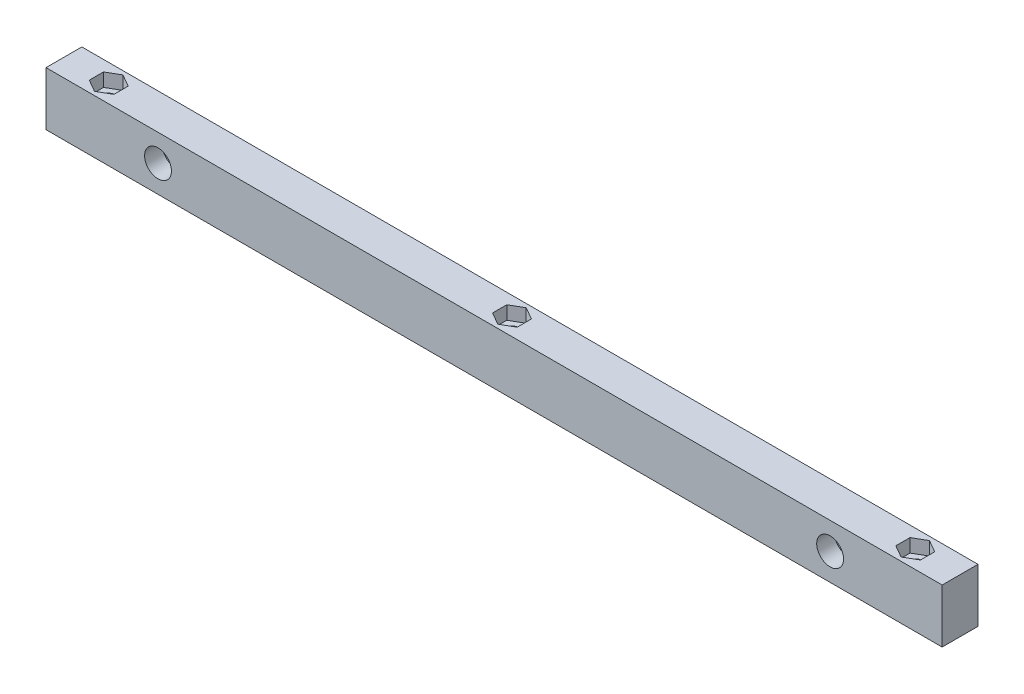
ISO-10303-21;
HEADER;
FILE_DESCRIPTION(('STEP AP214'),'2;1');
FILE_NAME('part.step','',(''),(''),'','','');
FILE_SCHEMA(('AUTOMOTIVE_DESIGN { 1 0 10303 214 1 1 1 1 }'));
ENDSEC;
DATA;
#1=APPLICATION_CONTEXT('core data for automotive mechanical design processes');
#2=APPLICATION_PROTOCOL_DEFINITION('international standard','automotive_design',2000,#1);
#3=PRODUCT_CONTEXT('',#1,'mechanical');
#4=PRODUCT('Part','Part','',(#3));
#5=PRODUCT_RELATED_PRODUCT_CATEGORY('part','',(#4));
#6=PRODUCT_DEFINITION_FORMATION('','',#4);
#7=PRODUCT_DEFINITION_CONTEXT('part definition',#1,'design');
#8=PRODUCT_DEFINITION('design','',#6,#7);
#9=PRODUCT_DEFINITION_SHAPE('','',#8);
#10=(LENGTH_UNIT() NAMED_UNIT(*) SI_UNIT(.MILLI.,.METRE.));
#11=(NAMED_UNIT(*) PLANE_ANGLE_UNIT() SI_UNIT($,.RADIAN.));
#12=(NAMED_UNIT(*) SI_UNIT($,.STERADIAN.) SOLID_ANGLE_UNIT());
#13=UNCERTAINTY_MEASURE_WITH_UNIT(LENGTH_MEASURE(1.E-05),#10,'distance_accuracy_value','');
#14=(GEOMETRIC_REPRESENTATION_CONTEXT(3) GLOBAL_UNCERTAINTY_ASSIGNED_CONTEXT((#13)) GLOBAL_UNIT_ASSIGNED_CONTEXT((#10,
#11,#12)) REPRESENTATION_CONTEXT('',''));
#15=CARTESIAN_POINT('',(0.,0.,0.));
#16=DIRECTION('',(0.,0.,1.));
#17=DIRECTION('',(1.,0.,0.));
#18=AXIS2_PLACEMENT_3D('',#15,#16,#17);
#19=CARTESIAN_POINT('',(90.,0.,-4.));
#20=DIRECTION('',(0.,1.,0.));
#21=DIRECTION('',(0.,0.,1.));
#22=AXIS2_PLACEMENT_3D('',#19,#20,#21);
#23=CYLINDRICAL_SURFACE('',#22,1.5);
#24=CARTESIAN_POINT('',(90.,0.,-4.));
#25=DIRECTION('',(0.,1.,0.));
#26=DIRECTION('',(0.,0.,1.));
#27=AXIS2_PLACEMENT_3D('',#24,#25,#26);
#28=CIRCLE('',#27,1.5);
#29=CARTESIAN_POINT('',(90.,0.,-2.5));
#30=VERTEX_POINT('',#29);
#31=EDGE_CURVE('E349',#30,#30,#28,.T.);
#32=ORIENTED_EDGE('',*,*,#31,.F.);
#33=EDGE_LOOP('',(#32));
#34=FACE_BOUND('',#33,.T.);
#35=CARTESIAN_POINT('',(90.,9.00000000000001,-4.));
#36=DIRECTION('',(0.,1.,0.));
#37=DIRECTION('',(0.,0.,1.));
#38=AXIS2_PLACEMENT_3D('',#35,#36,#37);
#39=CIRCLE('',#38,1.5);
#40=CARTESIAN_POINT('',(90.,9.00000000000001,-2.5));
#41=VERTEX_POINT('',#40);
#42=EDGE_CURVE('E36',#41,#41,#39,.F.);
#43=ORIENTED_EDGE('',*,*,#42,.F.);
#44=EDGE_LOOP('',(#43));
#45=FACE_BOUND('',#44,.T.);
#46=ADVANCED_FACE('F32',(#34,#45),#23,.F.);
#47=CARTESIAN_POINT('',(0.,0.,-4.));
#48=DIRECTION('',(0.,1.,0.));
#49=DIRECTION('',(0.,0.,1.));
#50=AXIS2_PLACEMENT_3D('',#47,#48,#49);
#51=CYLINDRICAL_SURFACE('',#50,1.5);
#52=CARTESIAN_POINT('',(0.,0.,-4.));
#53=DIRECTION('',(0.,1.,0.));
#54=DIRECTION('',(0.,0.,1.));
#55=AXIS2_PLACEMENT_3D('',#52,#53,#54);
#56=CIRCLE('',#55,1.5);
#57=CARTESIAN_POINT('',(0.,0.,-2.5));
#58=VERTEX_POINT('',#57);
#59=EDGE_CURVE('E358',#58,#58,#56,.T.);
#60=ORIENTED_EDGE('',*,*,#59,.F.);
#61=EDGE_LOOP('',(#60));
#62=FACE_BOUND('',#61,.T.);
#63=CARTESIAN_POINT('',(0.,9.00000000000001,-4.));
#64=DIRECTION('',(0.,1.,0.));
#65=DIRECTION('',(0.,0.,1.));
#66=AXIS2_PLACEMENT_3D('',#63,#64,#65);
#67=CIRCLE('',#66,1.5);
#68=CARTESIAN_POINT('',(0.,9.00000000000001,-2.5));
#69=VERTEX_POINT('',#68);
#70=EDGE_CURVE('E393',#69,#69,#67,.F.);
#71=ORIENTED_EDGE('',*,*,#70,.F.);
#72=EDGE_LOOP('',(#71));
#73=FACE_BOUND('',#72,.T.);
#74=ADVANCED_FACE('F403',(#62,#73),#51,.F.);
#75=CARTESIAN_POINT('',(-90.,0.,-4.));
#76=DIRECTION('',(0.,1.,0.));
#77=DIRECTION('',(0.,0.,1.));
#78=AXIS2_PLACEMENT_3D('',#75,#76,#77);
#79=CYLINDRICAL_SURFACE('',#78,1.5);
#80=CARTESIAN_POINT('',(-90.,0.,-4.));
#81=DIRECTION('',(0.,1.,0.));
#82=DIRECTION('',(0.,0.,1.));
#83=AXIS2_PLACEMENT_3D('',#80,#81,#82);
#84=CIRCLE('',#83,1.5);
#85=CARTESIAN_POINT('',(-90.,0.,-2.5));
#86=VERTEX_POINT('',#85);
#87=EDGE_CURVE('E354',#86,#86,#84,.T.);
#88=ORIENTED_EDGE('',*,*,#87,.F.);
#89=EDGE_LOOP('',(#88));
#90=FACE_BOUND('',#89,.T.);
#91=CARTESIAN_POINT('',(-90.,9.00000000000001,-4.));
#92=DIRECTION('',(0.,1.,0.));
#93=DIRECTION('',(0.,0.,1.));
#94=AXIS2_PLACEMENT_3D('',#91,#92,#93);
#95=CIRCLE('',#94,1.5);
#96=CARTESIAN_POINT('',(-90.,9.00000000000001,-2.5));
#97=VERTEX_POINT('',#96);
#98=EDGE_CURVE('E232',#97,#97,#95,.F.);
#99=ORIENTED_EDGE('',*,*,#98,.F.);
#100=EDGE_LOOP('',(#99));
#101=FACE_BOUND('',#100,.T.);
#102=ADVANCED_FACE('F409',(#90,#101),#79,.F.);
#103=CARTESIAN_POINT('',(75.,6.,-8.));
#104=DIRECTION('',(0.,0.,1.));
#105=DIRECTION('',(1.,0.,0.));
#106=AXIS2_PLACEMENT_3D('',#103,#104,#105);
#107=CYLINDRICAL_SURFACE('',#106,1.5);
#108=CARTESIAN_POINT('',(75.,6.,-8.));
#109=DIRECTION('',(0.,0.,1.));
#110=DIRECTION('',(-1.,0.,0.));
#111=AXIS2_PLACEMENT_3D('',#108,#109,#110);
#112=CIRCLE('',#111,1.5);
#113=CARTESIAN_POINT('',(73.5,6.,-8.));
#114=VERTEX_POINT('',#113);
#115=EDGE_CURVE('E350',#114,#114,#112,.T.);
#116=ORIENTED_EDGE('',*,*,#115,.F.);
#117=EDGE_LOOP('',(#116));
#118=FACE_BOUND('',#117,.T.);
#119=CARTESIAN_POINT('',(75.,6.,-4.));
#120=DIRECTION('',(0.,0.,1.));
#121=DIRECTION('',(1.,0.,0.));
#122=AXIS2_PLACEMENT_3D('',#119,#120,#121);
#123=CIRCLE('',#122,1.5);
#124=CARTESIAN_POINT('',(76.5,6.,-4.));
#125=VERTEX_POINT('',#124);
#126=EDGE_CURVE('E353',#125,#125,#123,.F.);
#127=ORIENTED_EDGE('',*,*,#126,.F.);
#128=EDGE_LOOP('',(#127));
#129=FACE_BOUND('',#128,.T.);
#130=ADVANCED_FACE('F475',(#118,#129),#107,.F.);
#131=CARTESIAN_POINT('',(-75.,6.,-8.));
#132=DIRECTION('',(0.,0.,1.));
#133=DIRECTION('',(1.,0.,0.));
#134=AXIS2_PLACEMENT_3D('',#131,#132,#133);
#135=CYLINDRICAL_SURFACE('',#134,1.5);
#136=CARTESIAN_POINT('',(-75.,6.,-8.));
#137=DIRECTION('',(0.,0.,1.));
#138=DIRECTION('',(1.,0.,0.));
#139=AXIS2_PLACEMENT_3D('',#136,#137,#138);
#140=CIRCLE('',#139,1.5);
#141=CARTESIAN_POINT('',(-73.5,6.,-8.));
#142=VERTEX_POINT('',#141);
#143=EDGE_CURVE('E346',#142,#142,#140,.T.);
#144=ORIENTED_EDGE('',*,*,#143,.F.);
#145=EDGE_LOOP('',(#144));
#146=FACE_BOUND('',#145,.T.);
#147=CARTESIAN_POINT('',(-75.,6.,-4.));
#148=DIRECTION('',(0.,0.,1.));
#149=DIRECTION('',(1.,0.,0.));
#150=AXIS2_PLACEMENT_3D('',#147,#148,#149);
#151=CIRCLE('',#150,1.5);
#152=CARTESIAN_POINT('',(-73.5,6.,-4.));
#153=VERTEX_POINT('',#152);
#154=EDGE_CURVE('E336',#153,#153,#151,.F.);
#155=ORIENTED_EDGE('',*,*,#154,.F.);
#156=EDGE_LOOP('',(#155));
#157=FACE_BOUND('',#156,.T.);
#158=ADVANCED_FACE('F437',(#146,#157),#135,.F.);
#159=CARTESIAN_POINT('',(-100.,12.,-8.));
#160=DIRECTION('',(1.,0.,0.));
#161=DIRECTION('',(0.,0.,-1.));
#162=AXIS2_PLACEMENT_3D('',#159,#160,#161);
#163=PLANE('',#162);
#164=DIRECTION('',(0.,0.,1.));
#165=VECTOR('',#164,1.);
#166=CARTESIAN_POINT('',(-100.,0.,-8.));
#167=LINE('',#166,#165);
#168=CARTESIAN_POINT('',(-100.,0.,-8.));
#169=VERTEX_POINT('',#168);
#170=CARTESIAN_POINT('',(-100.,0.,0.));
#171=VERTEX_POINT('',#170);
#172=EDGE_CURVE('E357',#169,#171,#167,.T.);
#173=ORIENTED_EDGE('',*,*,#172,.T.);
#174=DIRECTION('',(0.,-1.,0.));
#175=VECTOR('',#174,1.);
#176=CARTESIAN_POINT('',(-100.,12.,0.));
#177=LINE('',#176,#175);
#178=CARTESIAN_POINT('',(-100.,12.,0.));
#179=VERTEX_POINT('',#178);
#180=EDGE_CURVE('E11',#179,#171,#177,.T.);
#181=ORIENTED_EDGE('',*,*,#180,.F.);
#182=DIRECTION('',(0.,0.,1.));
#183=VECTOR('',#182,1.);
#184=CARTESIAN_POINT('',(-100.,12.,-8.));
#185=LINE('',#184,#183);
#186=CARTESIAN_POINT('',(-100.,12.,-8.));
#187=VERTEX_POINT('',#186);
#188=EDGE_CURVE('E363',#187,#179,#185,.T.);
#189=ORIENTED_EDGE('',*,*,#188,.F.);
#190=DIRECTION('',(0.,-1.,0.));
#191=VECTOR('',#190,1.);
#192=CARTESIAN_POINT('',(-100.,12.,-8.));
#193=LINE('',#192,#191);
#194=EDGE_CURVE('E373',#187,#169,#193,.T.);
#195=ORIENTED_EDGE('',*,*,#194,.T.);
#196=EDGE_LOOP('',(#173,#181,#189,#195));
#197=FACE_BOUND('',#196,.T.);
#198=ADVANCED_FACE('F34',(#197),#163,.F.);
#199=CARTESIAN_POINT('',(-100.,12.,0.));
#200=DIRECTION('',(0.,0.,-1.));
#201=DIRECTION('',(-1.,0.,0.));
#202=AXIS2_PLACEMENT_3D('',#199,#200,#201);
#203=PLANE('',#202);
#204=CARTESIAN_POINT('',(-75.,6.,0.));
#205=DIRECTION('',(0.,0.,1.));
#206=DIRECTION('',(1.,0.,0.));
#207=AXIS2_PLACEMENT_3D('',#204,#205,#206);
#208=CIRCLE('',#207,3.00000000000001);
#209=CARTESIAN_POINT('',(-72.,6.,0.));
#210=VERTEX_POINT('',#209);
#211=EDGE_CURVE('E337',#210,#210,#208,.T.);
#212=ORIENTED_EDGE('',*,*,#211,.F.);
#213=EDGE_LOOP('',(#212));
#214=FACE_BOUND('',#213,.T.);
#215=CARTESIAN_POINT('',(75.,6.,0.));
#216=DIRECTION('',(0.,0.,1.));
#217=DIRECTION('',(1.,0.,0.));
#218=AXIS2_PLACEMENT_3D('',#215,#216,#217);
#219=CIRCLE('',#218,3.00000000000001);
#220=CARTESIAN_POINT('',(78.,6.,0.));
#221=VERTEX_POINT('',#220);
#222=EDGE_CURVE('E343',#221,#221,#219,.T.);
#223=ORIENTED_EDGE('',*,*,#222,.F.);
#224=EDGE_LOOP('',(#223));
#225=FACE_BOUND('',#224,.T.);
#226=DIRECTION('',(1.,0.,0.));
#227=VECTOR('',#226,1.);
#228=CARTESIAN_POINT('',(-100.,0.,0.));
#229=LINE('',#228,#227);
#230=CARTESIAN_POINT('',(100.,0.,0.));
#231=VERTEX_POINT('',#230);
#232=EDGE_CURVE('E376',#171,#231,#229,.T.);
#233=ORIENTED_EDGE('',*,*,#232,.T.);
#234=DIRECTION('',(0.,-1.,0.));
#235=VECTOR('',#234,1.);
#236=CARTESIAN_POINT('',(100.,12.,0.));
#237=LINE('',#236,#235);
#238=CARTESIAN_POINT('',(100.,12.,0.));
#239=VERTEX_POINT('',#238);
#240=EDGE_CURVE('E41',#239,#231,#237,.T.);
#241=ORIENTED_EDGE('',*,*,#240,.F.);
#242=DIRECTION('',(1.,0.,0.));
#243=VECTOR('',#242,1.);
#244=CARTESIAN_POINT('',(-100.,12.,0.));
#245=LINE('',#244,#243);
#246=EDGE_CURVE('E366',#179,#239,#245,.T.);
#247=ORIENTED_EDGE('',*,*,#246,.F.);
#248=ORIENTED_EDGE('',*,*,#180,.T.);
#249=EDGE_LOOP('',(#233,#241,#247,#248));
#250=FACE_BOUND('',#249,.T.);
#251=ADVANCED_FACE('F430',(#214,#225,#250),#203,.F.);
#252=CARTESIAN_POINT('',(100.,12.,-8.));
#253=DIRECTION('',(-1.,0.,0.));
#254=DIRECTION('',(0.,0.,1.));
#255=AXIS2_PLACEMENT_3D('',#252,#253,#254);
#256=PLANE('',#255);
#257=DIRECTION('',(0.,0.,-1.));
#258=VECTOR('',#257,1.);
#259=CARTESIAN_POINT('',(100.,0.,-8.));
#260=LINE('',#259,#258);
#261=CARTESIAN_POINT('',(100.,0.,-8.));
#262=VERTEX_POINT('',#261);
#263=EDGE_CURVE('E378',#231,#262,#260,.T.);
#264=ORIENTED_EDGE('',*,*,#263,.T.);
#265=DIRECTION('',(0.,-1.,0.));
#266=VECTOR('',#265,1.);
#267=CARTESIAN_POINT('',(100.,12.,-8.));
#268=LINE('',#267,#266);
#269=CARTESIAN_POINT('',(100.,12.,-8.));
#270=VERTEX_POINT('',#269);
#271=EDGE_CURVE('E383',#270,#262,#268,.T.);
#272=ORIENTED_EDGE('',*,*,#271,.F.);
#273=DIRECTION('',(0.,0.,-1.));
#274=VECTOR('',#273,1.);
#275=CARTESIAN_POINT('',(100.,12.,-8.));
#276=LINE('',#275,#274);
#277=EDGE_CURVE('E369',#239,#270,#276,.T.);
#278=ORIENTED_EDGE('',*,*,#277,.F.);
#279=ORIENTED_EDGE('',*,*,#240,.T.);
#280=EDGE_LOOP('',(#264,#272,#278,#279));
#281=FACE_BOUND('',#280,.T.);
#282=ADVANCED_FACE('F427',(#281),#256,.F.);
#283=CARTESIAN_POINT('',(-100.,12.,-8.));
#284=DIRECTION('',(0.,0.,1.));
#285=DIRECTION('',(1.,0.,0.));
#286=AXIS2_PLACEMENT_3D('',#283,#284,#285);
#287=PLANE('',#286);
#288=ORIENTED_EDGE('',*,*,#143,.T.);
#289=EDGE_LOOP('',(#288));
#290=FACE_BOUND('',#289,.T.);
#291=ORIENTED_EDGE('',*,*,#115,.T.);
#292=EDGE_LOOP('',(#291));
#293=FACE_BOUND('',#292,.T.);
#294=DIRECTION('',(-1.,0.,0.));
#295=VECTOR('',#294,1.);
#296=CARTESIAN_POINT('',(-100.,0.,-8.));
#297=LINE('',#296,#295);
#298=EDGE_CURVE('E367',#262,#169,#297,.T.);
#299=ORIENTED_EDGE('',*,*,#298,.T.);
#300=ORIENTED_EDGE('',*,*,#194,.F.);
#301=DIRECTION('',(-1.,0.,0.));
#302=VECTOR('',#301,1.);
#303=CARTESIAN_POINT('',(-100.,12.,-8.));
#304=LINE('',#303,#302);
#305=EDGE_CURVE('E371',#270,#187,#304,.T.);
#306=ORIENTED_EDGE('',*,*,#305,.F.);
#307=ORIENTED_EDGE('',*,*,#271,.T.);
#308=EDGE_LOOP('',(#299,#300,#306,#307));
#309=FACE_BOUND('',#308,.T.);
#310=ADVANCED_FACE('F419',(#290,#293,#309),#287,.F.);
#311=CARTESIAN_POINT('',(0.,12.,0.));
#312=DIRECTION('',(0.,1.,0.));
#313=DIRECTION('',(0.,0.,1.));
#314=AXIS2_PLACEMENT_3D('',#311,#312,#313);
#315=PLANE('',#314);
#316=DIRECTION('',(0.,0.,-1.));
#317=VECTOR('',#316,1.);
#318=CARTESIAN_POINT('',(-87.25,12.,-2.41228675972853));
#319=LINE('',#318,#317);
#320=CARTESIAN_POINT('',(-87.25,12.,-2.41228675972853));
#321=VERTEX_POINT('',#320);
#322=CARTESIAN_POINT('',(-87.25,12.,-5.58771324027146));
#323=VERTEX_POINT('',#322);
#324=EDGE_CURVE('E49',#321,#323,#319,.T.);
#325=ORIENTED_EDGE('',*,*,#324,.F.);
#326=DIRECTION('',(0.866025403784438,0.,-0.500000000000001));
#327=VECTOR('',#326,1.);
#328=CARTESIAN_POINT('',(-90.,12.,-0.824573519457051));
#329=LINE('',#328,#327);
#330=CARTESIAN_POINT('',(-90.,12.,-0.824573519457051));
#331=VERTEX_POINT('',#330);
#332=EDGE_CURVE('E205',#331,#321,#329,.T.);
#333=ORIENTED_EDGE('',*,*,#332,.F.);
#334=DIRECTION('',(0.866025403784439,0.,0.5));
#335=VECTOR('',#334,1.);
#336=CARTESIAN_POINT('',(-92.75,12.,-2.41228675972852));
#337=LINE('',#336,#335);
#338=CARTESIAN_POINT('',(-92.75,12.,-2.41228675972852));
#339=VERTEX_POINT('',#338);
#340=EDGE_CURVE('E208',#339,#331,#337,.T.);
#341=ORIENTED_EDGE('',*,*,#340,.F.);
#342=DIRECTION('',(0.,0.,1.));
#343=VECTOR('',#342,1.);
#344=CARTESIAN_POINT('',(-92.75,12.,-5.58771324027147));
#345=LINE('',#344,#343);
#346=CARTESIAN_POINT('',(-92.75,12.,-5.58771324027147));
#347=VERTEX_POINT('',#346);
#348=EDGE_CURVE('E225',#347,#339,#345,.T.);
#349=ORIENTED_EDGE('',*,*,#348,.F.);
#350=DIRECTION('',(-0.866025403784439,0.,0.5));
#351=VECTOR('',#350,1.);
#352=CARTESIAN_POINT('',(-90.,12.,-7.17542648054294));
#353=LINE('',#352,#351);
#354=CARTESIAN_POINT('',(-90.,12.,-7.17542648054294));
#355=VERTEX_POINT('',#354);
#356=EDGE_CURVE('E222',#355,#347,#353,.T.);
#357=ORIENTED_EDGE('',*,*,#356,.F.);
#358=DIRECTION('',(-0.866025403784438,0.,-0.5));
#359=VECTOR('',#358,1.);
#360=CARTESIAN_POINT('',(-87.25,12.,-5.58771324027147));
#361=LINE('',#360,#359);
#362=EDGE_CURVE('E219',#323,#355,#361,.T.);
#363=ORIENTED_EDGE('',*,*,#362,.F.);
#364=EDGE_LOOP('',(#325,#333,#341,#349,#357,#363));
#365=FACE_BOUND('',#364,.T.);
#366=DIRECTION('',(0.,0.,-1.));
#367=VECTOR('',#366,1.);
#368=CARTESIAN_POINT('',(2.75,12.,-2.41228675972853));
#369=LINE('',#368,#367);
#370=CARTESIAN_POINT('',(2.75,12.,-2.41228675972853));
#371=VERTEX_POINT('',#370);
#372=CARTESIAN_POINT('',(2.75,12.,-5.58771324027147));
#373=VERTEX_POINT('',#372);
#374=EDGE_CURVE('E57',#371,#373,#369,.T.);
#375=ORIENTED_EDGE('',*,*,#374,.F.);
#376=DIRECTION('',(0.866025403784439,0.,-0.499999999999999));
#377=VECTOR('',#376,1.);
#378=CARTESIAN_POINT('',(0.,12.,-0.824573519457062));
#379=LINE('',#378,#377);
#380=CARTESIAN_POINT('',(0.,12.,-0.824573519457062));
#381=VERTEX_POINT('',#380);
#382=EDGE_CURVE('E244',#381,#371,#379,.T.);
#383=ORIENTED_EDGE('',*,*,#382,.F.);
#384=DIRECTION('',(0.866025403784439,0.,0.5));
#385=VECTOR('',#384,1.);
#386=CARTESIAN_POINT('',(-2.75,12.,-2.41228675972853));
#387=LINE('',#386,#385);
#388=CARTESIAN_POINT('',(-2.75,12.,-2.41228675972853));
#389=VERTEX_POINT('',#388);
#390=EDGE_CURVE('E271',#389,#381,#387,.T.);
#391=ORIENTED_EDGE('',*,*,#390,.F.);
#392=DIRECTION('',(0.,0.,1.));
#393=VECTOR('',#392,1.);
#394=CARTESIAN_POINT('',(-2.75,12.,-5.58771324027147));
#395=LINE('',#394,#393);
#396=CARTESIAN_POINT('',(-2.75,12.,-5.58771324027147));
#397=VERTEX_POINT('',#396);
#398=EDGE_CURVE('E268',#397,#389,#395,.T.);
#399=ORIENTED_EDGE('',*,*,#398,.F.);
#400=DIRECTION('',(-0.866025403784439,0.,0.5));
#401=VECTOR('',#400,1.);
#402=CARTESIAN_POINT('',(0.,12.,-7.17542648054294));
#403=LINE('',#402,#401);
#404=CARTESIAN_POINT('',(0.,12.,-7.17542648054294));
#405=VERTEX_POINT('',#404);
#406=EDGE_CURVE('E265',#405,#397,#403,.T.);
#407=ORIENTED_EDGE('',*,*,#406,.F.);
#408=DIRECTION('',(-0.866025403784439,0.,-0.5));
#409=VECTOR('',#408,1.);
#410=CARTESIAN_POINT('',(2.75,12.,-5.58771324027147));
#411=LINE('',#410,#409);
#412=EDGE_CURVE('E261',#373,#405,#411,.T.);
#413=ORIENTED_EDGE('',*,*,#412,.F.);
#414=EDGE_LOOP('',(#375,#383,#391,#399,#407,#413));
#415=FACE_BOUND('',#414,.T.);
#416=DIRECTION('',(0.,0.,-1.));
#417=VECTOR('',#416,1.);
#418=CARTESIAN_POINT('',(92.75,12.,-2.41228675972853));
#419=LINE('',#418,#417);
#420=CARTESIAN_POINT('',(92.75,12.,-2.41228675972853));
#421=VERTEX_POINT('',#420);
#422=CARTESIAN_POINT('',(92.75,12.,-5.58771324027146));
#423=VERTEX_POINT('',#422);
#424=EDGE_CURVE('E306',#421,#423,#419,.T.);
#425=ORIENTED_EDGE('',*,*,#424,.F.);
#426=DIRECTION('',(0.866025403784437,0.,-0.500000000000002));
#427=VECTOR('',#426,1.);
#428=CARTESIAN_POINT('',(90.,12.,-0.824573519457066));
#429=LINE('',#428,#427);
#430=CARTESIAN_POINT('',(90.,12.,-0.824573519457066));
#431=VERTEX_POINT('',#430);
#432=EDGE_CURVE('E290',#431,#421,#429,.T.);
#433=ORIENTED_EDGE('',*,*,#432,.F.);
#434=DIRECTION('',(0.866025403784439,0.,0.5));
#435=VECTOR('',#434,1.);
#436=CARTESIAN_POINT('',(87.25,12.,-2.41228675972854));
#437=LINE('',#436,#435);
#438=CARTESIAN_POINT('',(87.25,12.,-2.41228675972854));
#439=VERTEX_POINT('',#438);
#440=EDGE_CURVE('E317',#439,#431,#437,.T.);
#441=ORIENTED_EDGE('',*,*,#440,.F.);
#442=DIRECTION('',(0.,0.,1.));
#443=VECTOR('',#442,1.);
#444=CARTESIAN_POINT('',(87.25,12.,-5.58771324027145));
#445=LINE('',#444,#443);
#446=CARTESIAN_POINT('',(87.25,12.,-5.58771324027145));
#447=VERTEX_POINT('',#446);
#448=EDGE_CURVE('E314',#447,#439,#445,.T.);
#449=ORIENTED_EDGE('',*,*,#448,.F.);
#450=DIRECTION('',(-0.866025403784439,0.,0.5));
#451=VECTOR('',#450,1.);
#452=CARTESIAN_POINT('',(90.,12.,-7.17542648054293));
#453=LINE('',#452,#451);
#454=CARTESIAN_POINT('',(90.,12.,-7.17542648054293));
#455=VERTEX_POINT('',#454);
#456=EDGE_CURVE('E311',#455,#447,#453,.T.);
#457=ORIENTED_EDGE('',*,*,#456,.F.);
#458=DIRECTION('',(-0.866025403784438,0.,-0.5));
#459=VECTOR('',#458,1.);
#460=CARTESIAN_POINT('',(92.75,12.,-5.58771324027147));
#461=LINE('',#460,#459);
#462=EDGE_CURVE('E308',#423,#455,#461,.T.);
#463=ORIENTED_EDGE('',*,*,#462,.F.);
#464=EDGE_LOOP('',(#425,#433,#441,#449,#457,#463));
#465=FACE_BOUND('',#464,.T.);
#466=ORIENTED_EDGE('',*,*,#188,.T.);
#467=ORIENTED_EDGE('',*,*,#246,.T.);
#468=ORIENTED_EDGE('',*,*,#277,.T.);
#469=ORIENTED_EDGE('',*,*,#305,.T.);
#470=EDGE_LOOP('',(#466,#467,#468,#469));
#471=FACE_BOUND('',#470,.T.);
#472=ADVANCED_FACE('F415',(#365,#415,#465,#471),#315,.T.);
#473=CARTESIAN_POINT('',(0.,0.,0.));
#474=DIRECTION('',(0.,1.,0.));
#475=DIRECTION('',(0.,0.,1.));
#476=AXIS2_PLACEMENT_3D('',#473,#474,#475);
#477=PLANE('',#476);
#478=ORIENTED_EDGE('',*,*,#87,.T.);
#479=EDGE_LOOP('',(#478));
#480=FACE_BOUND('',#479,.T.);
#481=ORIENTED_EDGE('',*,*,#59,.T.);
#482=EDGE_LOOP('',(#481));
#483=FACE_BOUND('',#482,.T.);
#484=ORIENTED_EDGE('',*,*,#31,.T.);
#485=EDGE_LOOP('',(#484));
#486=FACE_BOUND('',#485,.T.);
#487=ORIENTED_EDGE('',*,*,#172,.F.);
#488=ORIENTED_EDGE('',*,*,#298,.F.);
#489=ORIENTED_EDGE('',*,*,#263,.F.);
#490=ORIENTED_EDGE('',*,*,#232,.F.);
#491=EDGE_LOOP('',(#487,#488,#489,#490));
#492=FACE_BOUND('',#491,.T.);
#493=ADVANCED_FACE('F418',(#480,#483,#486,#492),#477,.F.);
#494=CARTESIAN_POINT('',(-75.,6.,-4.));
#495=DIRECTION('',(0.,0.,1.));
#496=DIRECTION('',(1.,0.,0.));
#497=AXIS2_PLACEMENT_3D('',#494,#495,#496);
#498=PLANE('',#497);
#499=CARTESIAN_POINT('',(-75.,6.,-4.));
#500=DIRECTION('',(0.,0.,1.));
#501=DIRECTION('',(1.,0.,0.));
#502=AXIS2_PLACEMENT_3D('',#499,#500,#501);
#503=CIRCLE('',#502,3.00000000000001);
#504=CARTESIAN_POINT('',(-72.,6.,-4.));
#505=VERTEX_POINT('',#504);
#506=EDGE_CURVE('E333',#505,#505,#503,.T.);
#507=ORIENTED_EDGE('',*,*,#506,.T.);
#508=EDGE_LOOP('',(#507));
#509=FACE_BOUND('',#508,.T.);
#510=ORIENTED_EDGE('',*,*,#154,.T.);
#511=EDGE_LOOP('',(#510));
#512=FACE_BOUND('',#511,.T.);
#513=ADVANCED_FACE('F423',(#509,#512),#498,.T.);
#514=CARTESIAN_POINT('',(-75.,6.,-4.));
#515=DIRECTION('',(0.,0.,1.));
#516=DIRECTION('',(1.,0.,0.));
#517=AXIS2_PLACEMENT_3D('',#514,#515,#516);
#518=CYLINDRICAL_SURFACE('',#517,3.00000000000001);
#519=ORIENTED_EDGE('',*,*,#506,.F.);
#520=EDGE_LOOP('',(#519));
#521=FACE_BOUND('',#520,.T.);
#522=ORIENTED_EDGE('',*,*,#211,.T.);
#523=EDGE_LOOP('',(#522));
#524=FACE_BOUND('',#523,.T.);
#525=ADVANCED_FACE('F467',(#521,#524),#518,.F.);
#526=CARTESIAN_POINT('',(75.,6.,-4.));
#527=DIRECTION('',(0.,0.,1.));
#528=DIRECTION('',(1.,0.,0.));
#529=AXIS2_PLACEMENT_3D('',#526,#527,#528);
#530=PLANE('',#529);
#531=CARTESIAN_POINT('',(75.,6.,-4.));
#532=DIRECTION('',(0.,0.,1.));
#533=DIRECTION('',(1.,0.,0.));
#534=AXIS2_PLACEMENT_3D('',#531,#532,#533);
#535=CIRCLE('',#534,3.00000000000001);
#536=CARTESIAN_POINT('',(78.,6.,-4.));
#537=VERTEX_POINT('',#536);
#538=EDGE_CURVE('E340',#537,#537,#535,.T.);
#539=ORIENTED_EDGE('',*,*,#538,.T.);
#540=EDGE_LOOP('',(#539));
#541=FACE_BOUND('',#540,.T.);
#542=ORIENTED_EDGE('',*,*,#126,.T.);
#543=EDGE_LOOP('',(#542));
#544=FACE_BOUND('',#543,.T.);
#545=ADVANCED_FACE('F459',(#541,#544),#530,.T.);
#546=CARTESIAN_POINT('',(75.,6.,-4.));
#547=DIRECTION('',(0.,0.,1.));
#548=DIRECTION('',(1.,0.,0.));
#549=AXIS2_PLACEMENT_3D('',#546,#547,#548);
#550=CYLINDRICAL_SURFACE('',#549,3.00000000000001);
#551=ORIENTED_EDGE('',*,*,#538,.F.);
#552=EDGE_LOOP('',(#551));
#553=FACE_BOUND('',#552,.T.);
#554=ORIENTED_EDGE('',*,*,#222,.T.);
#555=EDGE_LOOP('',(#554));
#556=FACE_BOUND('',#555,.T.);
#557=ADVANCED_FACE('F457',(#553,#556),#550,.F.);
#558=CARTESIAN_POINT('',(0.,9.00000000000001,0.));
#559=DIRECTION('',(0.,1.,0.));
#560=DIRECTION('',(0.,0.,1.));
#561=AXIS2_PLACEMENT_3D('',#558,#559,#560);
#562=PLANE('',#561);
#563=DIRECTION('',(0.,0.,-1.));
#564=VECTOR('',#563,1.);
#565=CARTESIAN_POINT('',(-87.25,9.00000000000001,-2.41228675972853));
#566=LINE('',#565,#564);
#567=CARTESIAN_POINT('',(-87.25,9.00000000000001,-2.41228675972853));
#568=VERTEX_POINT('',#567);
#569=CARTESIAN_POINT('',(-87.25,9.00000000000001,-5.58771324027147));
#570=VERTEX_POINT('',#569);
#571=EDGE_CURVE('E185',#568,#570,#566,.T.);
#572=ORIENTED_EDGE('',*,*,#571,.T.);
#573=DIRECTION('',(-0.866025403784438,0.,-0.5));
#574=VECTOR('',#573,1.);
#575=CARTESIAN_POINT('',(-87.25,9.00000000000001,-5.58771324027147));
#576=LINE('',#575,#574);
#577=CARTESIAN_POINT('',(-90.,9.00000000000001,-7.17542648054294));
#578=VERTEX_POINT('',#577);
#579=EDGE_CURVE('E194',#570,#578,#576,.T.);
#580=ORIENTED_EDGE('',*,*,#579,.T.);
#581=DIRECTION('',(-0.866025403784439,0.,0.5));
#582=VECTOR('',#581,1.);
#583=CARTESIAN_POINT('',(-90.,9.00000000000001,-7.17542648054294));
#584=LINE('',#583,#582);
#585=CARTESIAN_POINT('',(-92.75,9.00000000000001,-5.58771324027147));
#586=VERTEX_POINT('',#585);
#587=EDGE_CURVE('E199',#578,#586,#584,.T.);
#588=ORIENTED_EDGE('',*,*,#587,.T.);
#589=DIRECTION('',(0.,0.,1.));
#590=VECTOR('',#589,1.);
#591=CARTESIAN_POINT('',(-92.75,9.00000000000001,-5.58771324027147));
#592=LINE('',#591,#590);
#593=CARTESIAN_POINT('',(-92.75,9.00000000000001,-2.41228675972852));
#594=VERTEX_POINT('',#593);
#595=EDGE_CURVE('E212',#586,#594,#592,.T.);
#596=ORIENTED_EDGE('',*,*,#595,.T.);
#597=DIRECTION('',(0.866025403784439,0.,0.5));
#598=VECTOR('',#597,1.);
#599=CARTESIAN_POINT('',(-92.75,9.00000000000001,-2.41228675972852));
#600=LINE('',#599,#598);
#601=CARTESIAN_POINT('',(-90.,9.00000000000001,-0.824573519457051));
#602=VERTEX_POINT('',#601);
#603=EDGE_CURVE('E215',#594,#602,#600,.T.);
#604=ORIENTED_EDGE('',*,*,#603,.T.);
#605=DIRECTION('',(0.866025403784438,0.,-0.500000000000001));
#606=VECTOR('',#605,1.);
#607=CARTESIAN_POINT('',(-90.,9.00000000000001,-0.824573519457051));
#608=LINE('',#607,#606);
#609=EDGE_CURVE('E191',#602,#568,#608,.T.);
#610=ORIENTED_EDGE('',*,*,#609,.T.);
#611=EDGE_LOOP('',(#572,#580,#588,#596,#604,#610));
#612=FACE_BOUND('',#611,.T.);
#613=ORIENTED_EDGE('',*,*,#98,.T.);
#614=EDGE_LOOP('',(#613));
#615=FACE_BOUND('',#614,.T.);
#616=ADVANCED_FACE('F201',(#612,#615),#562,.T.);
#617=CARTESIAN_POINT('',(-87.25,9.00000000000001,-2.41228675972853));
#618=DIRECTION('',(1.,0.,0.));
#619=DIRECTION('',(0.,0.,-1.));
#620=AXIS2_PLACEMENT_3D('',#617,#618,#619);
#621=PLANE('',#620);
#622=ORIENTED_EDGE('',*,*,#324,.T.);
#623=DIRECTION('',(0.,1.,0.));
#624=VECTOR('',#623,1.);
#625=CARTESIAN_POINT('',(-87.25,9.00000000000001,-5.58771324027147));
#626=LINE('',#625,#624);
#627=EDGE_CURVE('E181',#570,#323,#626,.T.);
#628=ORIENTED_EDGE('',*,*,#627,.F.);
#629=ORIENTED_EDGE('',*,*,#571,.F.);
#630=DIRECTION('',(0.,1.,0.));
#631=VECTOR('',#630,1.);
#632=CARTESIAN_POINT('',(-87.25,9.00000000000001,-2.41228675972853));
#633=LINE('',#632,#631);
#634=EDGE_CURVE('E230',#568,#321,#633,.T.);
#635=ORIENTED_EDGE('',*,*,#634,.T.);
#636=EDGE_LOOP('',(#622,#628,#629,#635));
#637=FACE_BOUND('',#636,.T.);
#638=ADVANCED_FACE('F183',(#637),#621,.F.);
#639=CARTESIAN_POINT('',(-90.,9.00000000000001,-0.824573519457051));
#640=DIRECTION('',(0.500000000000001,0.,0.866025403784438));
#641=DIRECTION('',(0.866025403784438,0.,-0.500000000000001));
#642=AXIS2_PLACEMENT_3D('',#639,#640,#641);
#643=PLANE('',#642);
#644=ORIENTED_EDGE('',*,*,#332,.T.);
#645=ORIENTED_EDGE('',*,*,#634,.F.);
#646=ORIENTED_EDGE('',*,*,#609,.F.);
#647=DIRECTION('',(0.,1.,0.));
#648=VECTOR('',#647,1.);
#649=CARTESIAN_POINT('',(-90.,9.00000000000001,-0.824573519457051));
#650=LINE('',#649,#648);
#651=EDGE_CURVE('E233',#602,#331,#650,.T.);
#652=ORIENTED_EDGE('',*,*,#651,.T.);
#653=EDGE_LOOP('',(#644,#645,#646,#652));
#654=FACE_BOUND('',#653,.T.);
#655=ADVANCED_FACE('F546',(#654),#643,.F.);
#656=CARTESIAN_POINT('',(-92.75,9.00000000000001,-2.41228675972852));
#657=DIRECTION('',(-0.5,0.,0.866025403784439));
#658=DIRECTION('',(0.866025403784439,0.,0.5));
#659=AXIS2_PLACEMENT_3D('',#656,#657,#658);
#660=PLANE('',#659);
#661=ORIENTED_EDGE('',*,*,#340,.T.);
#662=ORIENTED_EDGE('',*,*,#651,.F.);
#663=ORIENTED_EDGE('',*,*,#603,.F.);
#664=DIRECTION('',(0.,1.,0.));
#665=VECTOR('',#664,1.);
#666=CARTESIAN_POINT('',(-92.75,9.00000000000001,-2.41228675972852));
#667=LINE('',#666,#665);
#668=EDGE_CURVE('E235',#594,#339,#667,.T.);
#669=ORIENTED_EDGE('',*,*,#668,.T.);
#670=EDGE_LOOP('',(#661,#662,#663,#669));
#671=FACE_BOUND('',#670,.T.);
#672=ADVANCED_FACE('F555',(#671),#660,.F.);
#673=CARTESIAN_POINT('',(-92.75,9.00000000000001,-5.58771324027147));
#674=DIRECTION('',(-1.,0.,0.));
#675=DIRECTION('',(0.,0.,1.));
#676=AXIS2_PLACEMENT_3D('',#673,#674,#675);
#677=PLANE('',#676);
#678=ORIENTED_EDGE('',*,*,#348,.T.);
#679=ORIENTED_EDGE('',*,*,#668,.F.);
#680=ORIENTED_EDGE('',*,*,#595,.F.);
#681=DIRECTION('',(0.,1.,0.));
#682=VECTOR('',#681,1.);
#683=CARTESIAN_POINT('',(-92.75,9.00000000000001,-5.58771324027147));
#684=LINE('',#683,#682);
#685=EDGE_CURVE('E237',#586,#347,#684,.T.);
#686=ORIENTED_EDGE('',*,*,#685,.T.);
#687=EDGE_LOOP('',(#678,#679,#680,#686));
#688=FACE_BOUND('',#687,.T.);
#689=ADVANCED_FACE('F565',(#688),#677,.F.);
#690=CARTESIAN_POINT('',(-90.,9.00000000000001,-7.17542648054294));
#691=DIRECTION('',(-0.5,0.,-0.866025403784439));
#692=DIRECTION('',(-0.866025403784439,0.,0.5));
#693=AXIS2_PLACEMENT_3D('',#690,#691,#692);
#694=PLANE('',#693);
#695=ORIENTED_EDGE('',*,*,#356,.T.);
#696=ORIENTED_EDGE('',*,*,#685,.F.);
#697=ORIENTED_EDGE('',*,*,#587,.F.);
#698=DIRECTION('',(0.,1.,0.));
#699=VECTOR('',#698,1.);
#700=CARTESIAN_POINT('',(-90.,9.00000000000001,-7.17542648054294));
#701=LINE('',#700,#699);
#702=EDGE_CURVE('E190',#578,#355,#701,.T.);
#703=ORIENTED_EDGE('',*,*,#702,.T.);
#704=EDGE_LOOP('',(#695,#696,#697,#703));
#705=FACE_BOUND('',#704,.T.);
#706=ADVANCED_FACE('F575',(#705),#694,.F.);
#707=CARTESIAN_POINT('',(-87.25,9.00000000000001,-5.58771324027147));
#708=DIRECTION('',(0.5,0.,-0.866025403784439));
#709=DIRECTION('',(-0.866025403784439,0.,-0.5));
#710=AXIS2_PLACEMENT_3D('',#707,#708,#709);
#711=PLANE('',#710);
#712=ORIENTED_EDGE('',*,*,#362,.T.);
#713=ORIENTED_EDGE('',*,*,#702,.F.);
#714=ORIENTED_EDGE('',*,*,#579,.F.);
#715=ORIENTED_EDGE('',*,*,#627,.T.);
#716=EDGE_LOOP('',(#712,#713,#714,#715));
#717=FACE_BOUND('',#716,.T.);
#718=ADVANCED_FACE('F195',(#717),#711,.F.);
#719=CARTESIAN_POINT('',(0.,9.00000000000001,0.));
#720=DIRECTION('',(0.,1.,0.));
#721=DIRECTION('',(0.,0.,1.));
#722=AXIS2_PLACEMENT_3D('',#719,#720,#721);
#723=PLANE('',#722);
#724=DIRECTION('',(0.,0.,-1.));
#725=VECTOR('',#724,1.);
#726=CARTESIAN_POINT('',(2.75,9.00000000000001,-2.41228675972853));
#727=LINE('',#726,#725);
#728=CARTESIAN_POINT('',(2.75,9.00000000000001,-2.41228675972853));
#729=VERTEX_POINT('',#728);
#730=CARTESIAN_POINT('',(2.75,9.00000000000001,-5.58771324027147));
#731=VERTEX_POINT('',#730);
#732=EDGE_CURVE('E240',#729,#731,#727,.T.);
#733=ORIENTED_EDGE('',*,*,#732,.T.);
#734=DIRECTION('',(-0.866025403784439,0.,-0.5));
#735=VECTOR('',#734,1.);
#736=CARTESIAN_POINT('',(2.75,9.00000000000001,-5.58771324027147));
#737=LINE('',#736,#735);
#738=CARTESIAN_POINT('',(0.,9.00000000000001,-7.17542648054294));
#739=VERTEX_POINT('',#738);
#740=EDGE_CURVE('E243',#731,#739,#737,.T.);
#741=ORIENTED_EDGE('',*,*,#740,.T.);
#742=DIRECTION('',(-0.866025403784439,0.,0.5));
#743=VECTOR('',#742,1.);
#744=CARTESIAN_POINT('',(0.,9.00000000000001,-7.17542648054294));
#745=LINE('',#744,#743);
#746=CARTESIAN_POINT('',(-2.75,9.00000000000001,-5.58771324027147));
#747=VERTEX_POINT('',#746);
#748=EDGE_CURVE('E247',#739,#747,#745,.T.);
#749=ORIENTED_EDGE('',*,*,#748,.T.);
#750=DIRECTION('',(0.,0.,1.));
#751=VECTOR('',#750,1.);
#752=CARTESIAN_POINT('',(-2.75,9.00000000000001,-5.58771324027147));
#753=LINE('',#752,#751);
#754=CARTESIAN_POINT('',(-2.75,9.00000000000001,-2.41228675972853));
#755=VERTEX_POINT('',#754);
#756=EDGE_CURVE('E250',#747,#755,#753,.T.);
#757=ORIENTED_EDGE('',*,*,#756,.T.);
#758=DIRECTION('',(0.866025403784439,0.,0.5));
#759=VECTOR('',#758,1.);
#760=CARTESIAN_POINT('',(-2.75,9.00000000000001,-2.41228675972853));
#761=LINE('',#760,#759);
#762=CARTESIAN_POINT('',(0.,9.00000000000001,-0.824573519457062));
#763=VERTEX_POINT('',#762);
#764=EDGE_CURVE('E253',#755,#763,#761,.T.);
#765=ORIENTED_EDGE('',*,*,#764,.T.);
#766=DIRECTION('',(0.866025403784439,0.,-0.499999999999999));
#767=VECTOR('',#766,1.);
#768=CARTESIAN_POINT('',(0.,9.00000000000001,-0.824573519457062));
#769=LINE('',#768,#767);
#770=EDGE_CURVE('E256',#763,#729,#769,.T.);
#771=ORIENTED_EDGE('',*,*,#770,.T.);
#772=EDGE_LOOP('',(#733,#741,#749,#757,#765,#771));
#773=FACE_BOUND('',#772,.T.);
#774=ORIENTED_EDGE('',*,*,#70,.T.);
#775=EDGE_LOOP('',(#774));
#776=FACE_BOUND('',#775,.T.);
#777=ADVANCED_FACE('F594',(#773,#776),#723,.T.);
#778=CARTESIAN_POINT('',(2.75,9.00000000000001,-2.41228675972853));
#779=DIRECTION('',(1.,0.,0.));
#780=DIRECTION('',(0.,0.,-1.));
#781=AXIS2_PLACEMENT_3D('',#778,#779,#780);
#782=PLANE('',#781);
#783=ORIENTED_EDGE('',*,*,#374,.T.);
#784=DIRECTION('',(0.,1.,0.));
#785=VECTOR('',#784,1.);
#786=CARTESIAN_POINT('',(2.75,9.00000000000001,-5.58771324027147));
#787=LINE('',#786,#785);
#788=EDGE_CURVE('E259',#731,#373,#787,.T.);
#789=ORIENTED_EDGE('',*,*,#788,.F.);
#790=ORIENTED_EDGE('',*,*,#732,.F.);
#791=DIRECTION('',(0.,1.,0.));
#792=VECTOR('',#791,1.);
#793=CARTESIAN_POINT('',(2.75,9.00000000000001,-2.41228675972853));
#794=LINE('',#793,#792);
#795=EDGE_CURVE('E220',#729,#371,#794,.T.);
#796=ORIENTED_EDGE('',*,*,#795,.T.);
#797=EDGE_LOOP('',(#783,#789,#790,#796));
#798=FACE_BOUND('',#797,.T.);
#799=ADVANCED_FACE('F603',(#798),#782,.F.);
#800=CARTESIAN_POINT('',(0.,9.00000000000001,-0.824573519457062));
#801=DIRECTION('',(0.499999999999999,0.,0.866025403784439));
#802=DIRECTION('',(0.866025403784439,0.,-0.499999999999999));
#803=AXIS2_PLACEMENT_3D('',#800,#801,#802);
#804=PLANE('',#803);
#805=ORIENTED_EDGE('',*,*,#382,.T.);
#806=ORIENTED_EDGE('',*,*,#795,.F.);
#807=ORIENTED_EDGE('',*,*,#770,.F.);
#808=DIRECTION('',(0.,1.,0.));
#809=VECTOR('',#808,1.);
#810=CARTESIAN_POINT('',(0.,9.00000000000001,-0.824573519457062));
#811=LINE('',#810,#809);
#812=EDGE_CURVE('E277',#763,#381,#811,.T.);
#813=ORIENTED_EDGE('',*,*,#812,.T.);
#814=EDGE_LOOP('',(#805,#806,#807,#813));
#815=FACE_BOUND('',#814,.T.);
#816=ADVANCED_FACE('F613',(#815),#804,.F.);
#817=CARTESIAN_POINT('',(-2.75,9.00000000000001,-2.41228675972853));
#818=DIRECTION('',(-0.5,0.,0.866025403784439));
#819=DIRECTION('',(0.866025403784439,0.,0.5));
#820=AXIS2_PLACEMENT_3D('',#817,#818,#819);
#821=PLANE('',#820);
#822=ORIENTED_EDGE('',*,*,#390,.T.);
#823=ORIENTED_EDGE('',*,*,#812,.F.);
#824=ORIENTED_EDGE('',*,*,#764,.F.);
#825=DIRECTION('',(0.,1.,0.));
#826=VECTOR('',#825,1.);
#827=CARTESIAN_POINT('',(-2.75,9.00000000000001,-2.41228675972853));
#828=LINE('',#827,#826);
#829=EDGE_CURVE('E279',#755,#389,#828,.T.);
#830=ORIENTED_EDGE('',*,*,#829,.T.);
#831=EDGE_LOOP('',(#822,#823,#824,#830));
#832=FACE_BOUND('',#831,.T.);
#833=ADVANCED_FACE('F622',(#832),#821,.F.);
#834=CARTESIAN_POINT('',(-2.75,9.00000000000001,-5.58771324027147));
#835=DIRECTION('',(-1.,0.,0.));
#836=DIRECTION('',(0.,0.,1.));
#837=AXIS2_PLACEMENT_3D('',#834,#835,#836);
#838=PLANE('',#837);
#839=ORIENTED_EDGE('',*,*,#398,.T.);
#840=ORIENTED_EDGE('',*,*,#829,.F.);
#841=ORIENTED_EDGE('',*,*,#756,.F.);
#842=DIRECTION('',(0.,1.,0.));
#843=VECTOR('',#842,1.);
#844=CARTESIAN_POINT('',(-2.75,9.00000000000001,-5.58771324027147));
#845=LINE('',#844,#843);
#846=EDGE_CURVE('E281',#747,#397,#845,.T.);
#847=ORIENTED_EDGE('',*,*,#846,.T.);
#848=EDGE_LOOP('',(#839,#840,#841,#847));
#849=FACE_BOUND('',#848,.T.);
#850=ADVANCED_FACE('F632',(#849),#838,.F.);
#851=CARTESIAN_POINT('',(0.,9.00000000000001,-7.17542648054294));
#852=DIRECTION('',(-0.5,0.,-0.866025403784439));
#853=DIRECTION('',(-0.866025403784439,0.,0.5));
#854=AXIS2_PLACEMENT_3D('',#851,#852,#853);
#855=PLANE('',#854);
#856=ORIENTED_EDGE('',*,*,#406,.T.);
#857=ORIENTED_EDGE('',*,*,#846,.F.);
#858=ORIENTED_EDGE('',*,*,#748,.F.);
#859=DIRECTION('',(0.,1.,0.));
#860=VECTOR('',#859,1.);
#861=CARTESIAN_POINT('',(0.,9.00000000000001,-7.17542648054294));
#862=LINE('',#861,#860);
#863=EDGE_CURVE('E283',#739,#405,#862,.T.);
#864=ORIENTED_EDGE('',*,*,#863,.T.);
#865=EDGE_LOOP('',(#856,#857,#858,#864));
#866=FACE_BOUND('',#865,.T.);
#867=ADVANCED_FACE('F642',(#866),#855,.F.);
#868=CARTESIAN_POINT('',(2.75,9.00000000000001,-5.58771324027147));
#869=DIRECTION('',(0.5,0.,-0.866025403784439));
#870=DIRECTION('',(-0.866025403784439,0.,-0.5));
#871=AXIS2_PLACEMENT_3D('',#868,#869,#870);
#872=PLANE('',#871);
#873=ORIENTED_EDGE('',*,*,#412,.T.);
#874=ORIENTED_EDGE('',*,*,#863,.F.);
#875=ORIENTED_EDGE('',*,*,#740,.F.);
#876=ORIENTED_EDGE('',*,*,#788,.T.);
#877=EDGE_LOOP('',(#873,#874,#875,#876));
#878=FACE_BOUND('',#877,.T.);
#879=ADVANCED_FACE('F652',(#878),#872,.F.);
#880=CARTESIAN_POINT('',(0.,9.00000000000001,0.));
#881=DIRECTION('',(0.,1.,0.));
#882=DIRECTION('',(0.,0.,1.));
#883=AXIS2_PLACEMENT_3D('',#880,#881,#882);
#884=PLANE('',#883);
#885=DIRECTION('',(0.,0.,-1.));
#886=VECTOR('',#885,1.);
#887=CARTESIAN_POINT('',(92.75,9.00000000000001,-2.41228675972853));
#888=LINE('',#887,#886);
#889=CARTESIAN_POINT('',(92.75,9.00000000000001,-2.41228675972853));
#890=VERTEX_POINT('',#889);
#891=CARTESIAN_POINT('',(92.75,9.00000000000001,-5.58771324027147));
#892=VERTEX_POINT('',#891);
#893=EDGE_CURVE('E286',#890,#892,#888,.T.);
#894=ORIENTED_EDGE('',*,*,#893,.T.);
#895=DIRECTION('',(-0.866025403784438,0.,-0.5));
#896=VECTOR('',#895,1.);
#897=CARTESIAN_POINT('',(92.75,9.00000000000001,-5.58771324027147));
#898=LINE('',#897,#896);
#899=CARTESIAN_POINT('',(90.,9.00000000000001,-7.17542648054293));
#900=VERTEX_POINT('',#899);
#901=EDGE_CURVE('E289',#892,#900,#898,.T.);
#902=ORIENTED_EDGE('',*,*,#901,.T.);
#903=DIRECTION('',(-0.866025403784439,0.,0.5));
#904=VECTOR('',#903,1.);
#905=CARTESIAN_POINT('',(90.,9.00000000000001,-7.17542648054293));
#906=LINE('',#905,#904);
#907=CARTESIAN_POINT('',(87.25,9.00000000000001,-5.58771324027145));
#908=VERTEX_POINT('',#907);
#909=EDGE_CURVE('E293',#900,#908,#906,.T.);
#910=ORIENTED_EDGE('',*,*,#909,.T.);
#911=DIRECTION('',(0.,0.,1.));
#912=VECTOR('',#911,1.);
#913=CARTESIAN_POINT('',(87.25,9.00000000000001,-5.58771324027145));
#914=LINE('',#913,#912);
#915=CARTESIAN_POINT('',(87.25,9.00000000000001,-2.41228675972854));
#916=VERTEX_POINT('',#915);
#917=EDGE_CURVE('E296',#908,#916,#914,.T.);
#918=ORIENTED_EDGE('',*,*,#917,.T.);
#919=DIRECTION('',(0.866025403784439,0.,0.5));
#920=VECTOR('',#919,1.);
#921=CARTESIAN_POINT('',(87.25,9.00000000000001,-2.41228675972854));
#922=LINE('',#921,#920);
#923=CARTESIAN_POINT('',(90.,9.00000000000001,-0.824573519457066));
#924=VERTEX_POINT('',#923);
#925=EDGE_CURVE('E299',#916,#924,#922,.T.);
#926=ORIENTED_EDGE('',*,*,#925,.T.);
#927=DIRECTION('',(0.866025403784437,0.,-0.500000000000002));
#928=VECTOR('',#927,1.);
#929=CARTESIAN_POINT('',(90.,9.00000000000001,-0.824573519457066));
#930=LINE('',#929,#928);
#931=EDGE_CURVE('E302',#924,#890,#930,.T.);
#932=ORIENTED_EDGE('',*,*,#931,.T.);
#933=EDGE_LOOP('',(#894,#902,#910,#918,#926,#932));
#934=FACE_BOUND('',#933,.T.);
#935=ORIENTED_EDGE('',*,*,#42,.T.);
#936=EDGE_LOOP('',(#935));
#937=FACE_BOUND('',#936,.T.);
#938=ADVANCED_FACE('F400',(#934,#937),#884,.T.);
#939=CARTESIAN_POINT('',(92.75,9.00000000000001,-2.41228675972853));
#940=DIRECTION('',(1.,0.,0.));
#941=DIRECTION('',(0.,0.,-1.));
#942=AXIS2_PLACEMENT_3D('',#939,#940,#941);
#943=PLANE('',#942);
#944=ORIENTED_EDGE('',*,*,#424,.T.);
#945=DIRECTION('',(0.,1.,0.));
#946=VECTOR('',#945,1.);
#947=CARTESIAN_POINT('',(92.75,9.00000000000001,-5.58771324027147));
#948=LINE('',#947,#946);
#949=EDGE_CURVE('E305',#892,#423,#948,.T.);
#950=ORIENTED_EDGE('',*,*,#949,.F.);
#951=ORIENTED_EDGE('',*,*,#893,.F.);
#952=DIRECTION('',(0.,1.,0.));
#953=VECTOR('',#952,1.);
#954=CARTESIAN_POINT('',(92.75,9.00000000000001,-2.41228675972853));
#955=LINE('',#954,#953);
#956=EDGE_CURVE('E262',#890,#421,#955,.T.);
#957=ORIENTED_EDGE('',*,*,#956,.T.);
#958=EDGE_LOOP('',(#944,#950,#951,#957));
#959=FACE_BOUND('',#958,.T.);
#960=ADVANCED_FACE('F671',(#959),#943,.F.);
#961=CARTESIAN_POINT('',(90.,9.00000000000001,-0.824573519457066));
#962=DIRECTION('',(0.500000000000002,0.,0.866025403784438));
#963=DIRECTION('',(0.866025403784438,0.,-0.500000000000002));
#964=AXIS2_PLACEMENT_3D('',#961,#962,#963);
#965=PLANE('',#964);
#966=ORIENTED_EDGE('',*,*,#432,.T.);
#967=ORIENTED_EDGE('',*,*,#956,.F.);
#968=ORIENTED_EDGE('',*,*,#931,.F.);
#969=DIRECTION('',(0.,1.,0.));
#970=VECTOR('',#969,1.);
#971=CARTESIAN_POINT('',(90.,9.00000000000001,-0.824573519457066));
#972=LINE('',#971,#970);
#973=EDGE_CURVE('E323',#924,#431,#972,.T.);
#974=ORIENTED_EDGE('',*,*,#973,.T.);
#975=EDGE_LOOP('',(#966,#967,#968,#974));
#976=FACE_BOUND('',#975,.T.);
#977=ADVANCED_FACE('F681',(#976),#965,.F.);
#978=CARTESIAN_POINT('',(87.25,9.00000000000001,-2.41228675972854));
#979=DIRECTION('',(-0.5,0.,0.866025403784439));
#980=DIRECTION('',(0.866025403784439,0.,0.5));
#981=AXIS2_PLACEMENT_3D('',#978,#979,#980);
#982=PLANE('',#981);
#983=ORIENTED_EDGE('',*,*,#440,.T.);
#984=ORIENTED_EDGE('',*,*,#973,.F.);
#985=ORIENTED_EDGE('',*,*,#925,.F.);
#986=DIRECTION('',(0.,1.,0.));
#987=VECTOR('',#986,1.);
#988=CARTESIAN_POINT('',(87.25,9.00000000000001,-2.41228675972854));
#989=LINE('',#988,#987);
#990=EDGE_CURVE('E325',#916,#439,#989,.T.);
#991=ORIENTED_EDGE('',*,*,#990,.T.);
#992=EDGE_LOOP('',(#983,#984,#985,#991));
#993=FACE_BOUND('',#992,.T.);
#994=ADVANCED_FACE('F691',(#993),#982,.F.);
#995=CARTESIAN_POINT('',(87.25,9.00000000000001,-5.58771324027145));
#996=DIRECTION('',(-1.,0.,0.));
#997=DIRECTION('',(0.,0.,1.));
#998=AXIS2_PLACEMENT_3D('',#995,#996,#997);
#999=PLANE('',#998);
#1000=ORIENTED_EDGE('',*,*,#448,.T.);
#1001=ORIENTED_EDGE('',*,*,#990,.F.);
#1002=ORIENTED_EDGE('',*,*,#917,.F.);
#1003=DIRECTION('',(0.,1.,0.));
#1004=VECTOR('',#1003,1.);
#1005=CARTESIAN_POINT('',(87.25,9.00000000000001,-5.58771324027145));
#1006=LINE('',#1005,#1004);
#1007=EDGE_CURVE('E327',#908,#447,#1006,.T.);
#1008=ORIENTED_EDGE('',*,*,#1007,.T.);
#1009=EDGE_LOOP('',(#1000,#1001,#1002,#1008));
#1010=FACE_BOUND('',#1009,.T.);
#1011=ADVANCED_FACE('F701',(#1010),#999,.F.);
#1012=CARTESIAN_POINT('',(90.,9.00000000000001,-7.17542648054293));
#1013=DIRECTION('',(-0.5,0.,-0.866025403784439));
#1014=DIRECTION('',(-0.866025403784439,0.,0.5));
#1015=AXIS2_PLACEMENT_3D('',#1012,#1013,#1014);
#1016=PLANE('',#1015);
#1017=ORIENTED_EDGE('',*,*,#456,.T.);
#1018=ORIENTED_EDGE('',*,*,#1007,.F.);
#1019=ORIENTED_EDGE('',*,*,#909,.F.);
#1020=DIRECTION('',(0.,1.,0.));
#1021=VECTOR('',#1020,1.);
#1022=CARTESIAN_POINT('',(90.,9.00000000000001,-7.17542648054293));
#1023=LINE('',#1022,#1021);
#1024=EDGE_CURVE('E329',#900,#455,#1023,.T.);
#1025=ORIENTED_EDGE('',*,*,#1024,.T.);
#1026=EDGE_LOOP('',(#1017,#1018,#1019,#1025));
#1027=FACE_BOUND('',#1026,.T.);
#1028=ADVANCED_FACE('F711',(#1027),#1016,.F.);
#1029=CARTESIAN_POINT('',(92.75,9.00000000000001,-5.58771324027147));
#1030=DIRECTION('',(0.5,0.,-0.866025403784438));
#1031=DIRECTION('',(-0.866025403784438,0.,-0.5));
#1032=AXIS2_PLACEMENT_3D('',#1029,#1030,#1031);
#1033=PLANE('',#1032);
#1034=ORIENTED_EDGE('',*,*,#462,.T.);
#1035=ORIENTED_EDGE('',*,*,#1024,.F.);
#1036=ORIENTED_EDGE('',*,*,#901,.F.);
#1037=ORIENTED_EDGE('',*,*,#949,.T.);
#1038=EDGE_LOOP('',(#1034,#1035,#1036,#1037));
#1039=FACE_BOUND('',#1038,.T.);
#1040=ADVANCED_FACE('F721',(#1039),#1033,.F.);
#1041=CLOSED_SHELL('',(#46,#74,#102,#130,#158,#198,#251,#282,#310,#472,#493,#513,#525,#545,#557,
#616,#638,#655,#672,#689,#706,#718,#777,#799,#816,#833,#850,#867,#879,#938,#960,#977,#994,#1011,
#1028,#1040));
#1042=MANIFOLD_SOLID_BREP('B2',#1041);
#1043=ADVANCED_BREP_SHAPE_REPRESENTATION('',(#18,#1042),#14);
#1044=SHAPE_DEFINITION_REPRESENTATION(#9,#1043);
ENDSEC;
END-ISO-10303-21;
